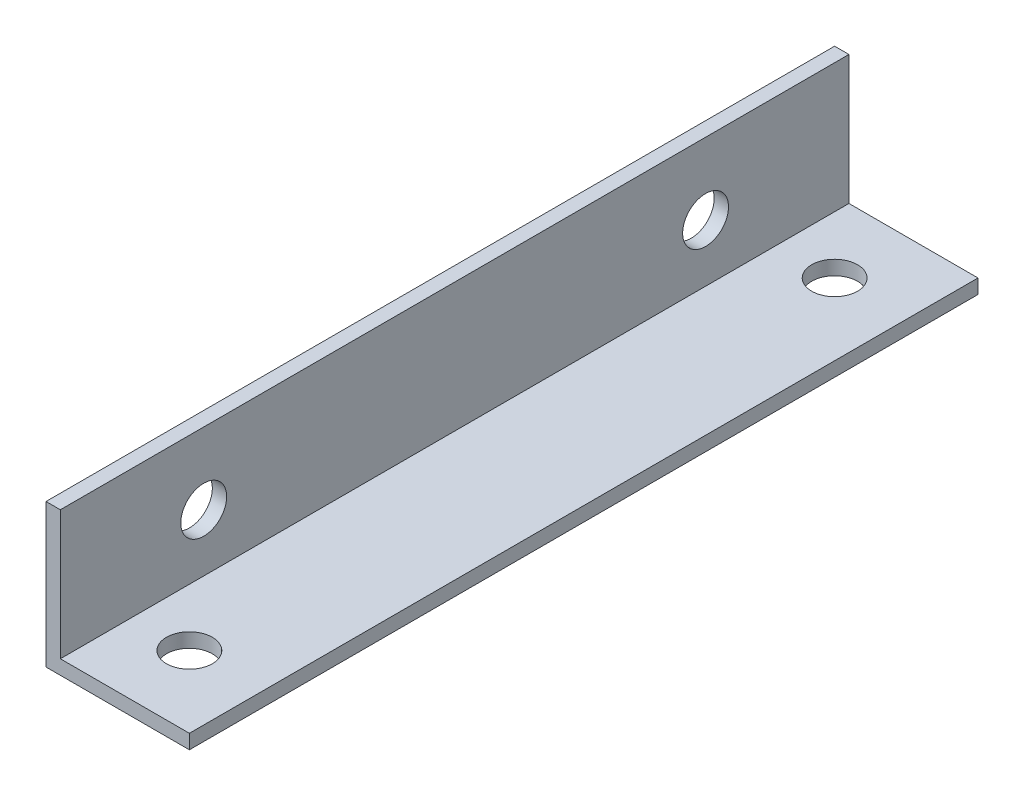
ISO-10303-21;
HEADER;
FILE_DESCRIPTION(('STEP AP214'),'2;1');
FILE_NAME('part.step','',(''),(''),'','','');
FILE_SCHEMA(('AUTOMOTIVE_DESIGN { 1 0 10303 214 1 1 1 1 }'));
ENDSEC;
DATA;
#1=APPLICATION_CONTEXT('core data for automotive mechanical design processes');
#2=APPLICATION_PROTOCOL_DEFINITION('international standard','automotive_design',2000,#1);
#3=PRODUCT_CONTEXT('',#1,'mechanical');
#4=PRODUCT('Part','Part','',(#3));
#5=PRODUCT_RELATED_PRODUCT_CATEGORY('part','',(#4));
#6=PRODUCT_DEFINITION_FORMATION('','',#4);
#7=PRODUCT_DEFINITION_CONTEXT('part definition',#1,'design');
#8=PRODUCT_DEFINITION('design','',#6,#7);
#9=PRODUCT_DEFINITION_SHAPE('','',#8);
#10=(LENGTH_UNIT() NAMED_UNIT(*) SI_UNIT(.MILLI.,.METRE.));
#11=(NAMED_UNIT(*) PLANE_ANGLE_UNIT() SI_UNIT($,.RADIAN.));
#12=(NAMED_UNIT(*) SI_UNIT($,.STERADIAN.) SOLID_ANGLE_UNIT());
#13=UNCERTAINTY_MEASURE_WITH_UNIT(LENGTH_MEASURE(1.E-05),#10,'distance_accuracy_value','');
#14=(GEOMETRIC_REPRESENTATION_CONTEXT(3) GLOBAL_UNCERTAINTY_ASSIGNED_CONTEXT((#13)) GLOBAL_UNIT_ASSIGNED_CONTEXT((#10,
#11,#12)) REPRESENTATION_CONTEXT('',''));
#15=CARTESIAN_POINT('',(0.,0.,0.));
#16=DIRECTION('',(0.,0.,1.));
#17=DIRECTION('',(1.,0.,0.));
#18=AXIS2_PLACEMENT_3D('',#15,#16,#17);
#19=CARTESIAN_POINT('',(-5.,-5.,55.));
#20=DIRECTION('',(1.,0.,0.));
#21=DIRECTION('',(0.,0.,-1.));
#22=AXIS2_PLACEMENT_3D('',#19,#20,#21);
#23=PLANE('',#22);
#24=CARTESIAN_POINT('',(-5.,0.,10.));
#25=DIRECTION('',(-1.,0.,0.));
#26=DIRECTION('',(0.,0.,1.));
#27=AXIS2_PLACEMENT_3D('',#24,#25,#26);
#28=CIRCLE('',#27,1.6);
#29=CARTESIAN_POINT('',(-5.,0.,11.6));
#30=VERTEX_POINT('',#29);
#31=EDGE_CURVE('E143',#30,#30,#28,.T.);
#32=ORIENTED_EDGE('',*,*,#31,.F.);
#33=EDGE_LOOP('',(#32));
#34=FACE_BOUND('',#33,.T.);
#35=CARTESIAN_POINT('',(-5.,0.,45.));
#36=DIRECTION('',(-1.,0.,0.));
#37=DIRECTION('',(0.,0.,1.));
#38=AXIS2_PLACEMENT_3D('',#35,#36,#37);
#39=CIRCLE('',#38,1.6);
#40=CARTESIAN_POINT('',(-5.,0.,46.6));
#41=VERTEX_POINT('',#40);
#42=EDGE_CURVE('E149',#41,#41,#39,.T.);
#43=ORIENTED_EDGE('',*,*,#42,.F.);
#44=EDGE_LOOP('',(#43));
#45=FACE_BOUND('',#44,.T.);
#46=DIRECTION('',(0.,-1.,0.));
#47=VECTOR('',#46,1.);
#48=CARTESIAN_POINT('',(-5.,-5.,0.));
#49=LINE('',#48,#47);
#50=CARTESIAN_POINT('',(-5.,5.,0.));
#51=VERTEX_POINT('',#50);
#52=CARTESIAN_POINT('',(-5.,-5.,0.));
#53=VERTEX_POINT('',#52);
#54=EDGE_CURVE('E119',#51,#53,#49,.T.);
#55=ORIENTED_EDGE('',*,*,#54,.T.);
#56=DIRECTION('',(0.,0.,-1.));
#57=VECTOR('',#56,1.);
#58=CARTESIAN_POINT('',(-5.,-5.,55.));
#59=LINE('',#58,#57);
#60=CARTESIAN_POINT('',(-5.,-5.,55.));
#61=VERTEX_POINT('',#60);
#62=EDGE_CURVE('E11',#61,#53,#59,.T.);
#63=ORIENTED_EDGE('',*,*,#62,.F.);
#64=DIRECTION('',(0.,-1.,0.));
#65=VECTOR('',#64,1.);
#66=CARTESIAN_POINT('',(-5.,-5.,55.));
#67=LINE('',#66,#65);
#68=CARTESIAN_POINT('',(-5.,5.,55.));
#69=VERTEX_POINT('',#68);
#70=EDGE_CURVE('E130',#69,#61,#67,.T.);
#71=ORIENTED_EDGE('',*,*,#70,.F.);
#72=DIRECTION('',(0.,0.,-1.));
#73=VECTOR('',#72,1.);
#74=CARTESIAN_POINT('',(-5.,5.,55.));
#75=LINE('',#74,#73);
#76=EDGE_CURVE('E115',#69,#51,#75,.T.);
#77=ORIENTED_EDGE('',*,*,#76,.T.);
#78=EDGE_LOOP('',(#55,#63,#71,#77));
#79=FACE_BOUND('',#78,.T.);
#80=ADVANCED_FACE('F33',(#34,#45,#79),#23,.F.);
#81=CARTESIAN_POINT('',(5.,-5.,55.));
#82=DIRECTION('',(0.,1.,0.));
#83=DIRECTION('',(-1.,0.,0.));
#84=AXIS2_PLACEMENT_3D('',#81,#82,#83);
#85=PLANE('',#84);
#86=CARTESIAN_POINT('',(0.,-5.,5.));
#87=DIRECTION('',(0.,-1.,0.));
#88=DIRECTION('',(1.,0.,0.));
#89=AXIS2_PLACEMENT_3D('',#86,#87,#88);
#90=CIRCLE('',#89,1.6);
#91=CARTESIAN_POINT('',(1.6,-5.,5.));
#92=VERTEX_POINT('',#91);
#93=EDGE_CURVE('E139',#92,#92,#90,.T.);
#94=ORIENTED_EDGE('',*,*,#93,.F.);
#95=EDGE_LOOP('',(#94));
#96=FACE_BOUND('',#95,.T.);
#97=CARTESIAN_POINT('',(0.,-5.,50.));
#98=DIRECTION('',(0.,-1.,0.));
#99=DIRECTION('',(1.,0.,0.));
#100=AXIS2_PLACEMENT_3D('',#97,#98,#99);
#101=CIRCLE('',#100,1.6);
#102=CARTESIAN_POINT('',(1.6,-5.,50.));
#103=VERTEX_POINT('',#102);
#104=EDGE_CURVE('E147',#103,#103,#101,.T.);
#105=ORIENTED_EDGE('',*,*,#104,.F.);
#106=EDGE_LOOP('',(#105));
#107=FACE_BOUND('',#106,.T.);
#108=DIRECTION('',(1.,0.,0.));
#109=VECTOR('',#108,1.);
#110=CARTESIAN_POINT('',(5.,-5.,0.));
#111=LINE('',#110,#109);
#112=CARTESIAN_POINT('',(5.,-5.,0.));
#113=VERTEX_POINT('',#112);
#114=EDGE_CURVE('E122',#53,#113,#111,.T.);
#115=ORIENTED_EDGE('',*,*,#114,.T.);
#116=DIRECTION('',(0.,0.,-1.));
#117=VECTOR('',#116,1.);
#118=CARTESIAN_POINT('',(5.,-5.,55.));
#119=LINE('',#118,#117);
#120=CARTESIAN_POINT('',(5.,-5.,55.));
#121=VERTEX_POINT('',#120);
#122=EDGE_CURVE('E42',#121,#113,#119,.T.);
#123=ORIENTED_EDGE('',*,*,#122,.F.);
#124=DIRECTION('',(1.,0.,0.));
#125=VECTOR('',#124,1.);
#126=CARTESIAN_POINT('',(5.,-5.,55.));
#127=LINE('',#126,#125);
#128=EDGE_CURVE('E88',#61,#121,#127,.T.);
#129=ORIENTED_EDGE('',*,*,#128,.F.);
#130=ORIENTED_EDGE('',*,*,#62,.T.);
#131=EDGE_LOOP('',(#115,#123,#129,#130));
#132=FACE_BOUND('',#131,.T.);
#133=ADVANCED_FACE('F163',(#96,#107,#132),#85,.F.);
#134=CARTESIAN_POINT('',(5.,-5.,55.));
#135=DIRECTION('',(-1.,0.,0.));
#136=DIRECTION('',(0.,-1.,0.));
#137=AXIS2_PLACEMENT_3D('',#134,#135,#136);
#138=PLANE('',#137);
#139=DIRECTION('',(0.,1.,0.));
#140=VECTOR('',#139,1.);
#141=CARTESIAN_POINT('',(5.,-5.,0.));
#142=LINE('',#141,#140);
#143=CARTESIAN_POINT('',(5.,-4.,0.));
#144=VERTEX_POINT('',#143);
#145=EDGE_CURVE('E125',#113,#144,#142,.T.);
#146=ORIENTED_EDGE('',*,*,#145,.T.);
#147=DIRECTION('',(0.,0.,-1.));
#148=VECTOR('',#147,1.);
#149=CARTESIAN_POINT('',(5.,-4.,55.));
#150=LINE('',#149,#148);
#151=CARTESIAN_POINT('',(5.,-4.,55.));
#152=VERTEX_POINT('',#151);
#153=EDGE_CURVE('E110',#152,#144,#150,.T.);
#154=ORIENTED_EDGE('',*,*,#153,.F.);
#155=DIRECTION('',(0.,1.,0.));
#156=VECTOR('',#155,1.);
#157=CARTESIAN_POINT('',(5.,-5.,55.));
#158=LINE('',#157,#156);
#159=EDGE_CURVE('E101',#121,#152,#158,.T.);
#160=ORIENTED_EDGE('',*,*,#159,.F.);
#161=ORIENTED_EDGE('',*,*,#122,.T.);
#162=EDGE_LOOP('',(#146,#154,#160,#161));
#163=FACE_BOUND('',#162,.T.);
#164=ADVANCED_FACE('F166',(#163),#138,.F.);
#165=CARTESIAN_POINT('',(-4.,-4.,55.));
#166=DIRECTION('',(0.,-1.,0.));
#167=DIRECTION('',(1.,0.,0.));
#168=AXIS2_PLACEMENT_3D('',#165,#166,#167);
#169=PLANE('',#168);
#170=CARTESIAN_POINT('',(0.,-4.,5.));
#171=DIRECTION('',(0.,-1.,0.));
#172=DIRECTION('',(1.,0.,0.));
#173=AXIS2_PLACEMENT_3D('',#170,#171,#172);
#174=CIRCLE('',#173,1.6);
#175=CARTESIAN_POINT('',(1.6,-4.,5.));
#176=VERTEX_POINT('',#175);
#177=EDGE_CURVE('E123',#176,#176,#174,.T.);
#178=ORIENTED_EDGE('',*,*,#177,.T.);
#179=EDGE_LOOP('',(#178));
#180=FACE_BOUND('',#179,.T.);
#181=CARTESIAN_POINT('',(0.,-4.,50.));
#182=DIRECTION('',(0.,-1.,0.));
#183=DIRECTION('',(1.,0.,0.));
#184=AXIS2_PLACEMENT_3D('',#181,#182,#183);
#185=CIRCLE('',#184,1.6);
#186=CARTESIAN_POINT('',(1.6,-4.,50.));
#187=VERTEX_POINT('',#186);
#188=EDGE_CURVE('E136',#187,#187,#185,.T.);
#189=ORIENTED_EDGE('',*,*,#188,.T.);
#190=EDGE_LOOP('',(#189));
#191=FACE_BOUND('',#190,.T.);
#192=DIRECTION('',(-1.,0.,0.));
#193=VECTOR('',#192,1.);
#194=CARTESIAN_POINT('',(-4.,-4.,0.));
#195=LINE('',#194,#193);
#196=CARTESIAN_POINT('',(-4.,-4.,0.));
#197=VERTEX_POINT('',#196);
#198=EDGE_CURVE('E109',#144,#197,#195,.T.);
#199=ORIENTED_EDGE('',*,*,#198,.T.);
#200=DIRECTION('',(0.,0.,-1.));
#201=VECTOR('',#200,1.);
#202=CARTESIAN_POINT('',(-4.,-4.,55.));
#203=LINE('',#202,#201);
#204=CARTESIAN_POINT('',(-4.,-4.,55.));
#205=VERTEX_POINT('',#204);
#206=EDGE_CURVE('E106',#205,#197,#203,.T.);
#207=ORIENTED_EDGE('',*,*,#206,.F.);
#208=DIRECTION('',(-1.,0.,0.));
#209=VECTOR('',#208,1.);
#210=CARTESIAN_POINT('',(-4.,-4.,55.));
#211=LINE('',#210,#209);
#212=EDGE_CURVE('E95',#152,#205,#211,.T.);
#213=ORIENTED_EDGE('',*,*,#212,.F.);
#214=ORIENTED_EDGE('',*,*,#153,.T.);
#215=EDGE_LOOP('',(#199,#207,#213,#214));
#216=FACE_BOUND('',#215,.T.);
#217=ADVANCED_FACE('F107',(#180,#191,#216),#169,.F.);
#218=CARTESIAN_POINT('',(-4.,5.,55.));
#219=DIRECTION('',(-1.,0.,0.));
#220=DIRECTION('',(0.,0.,1.));
#221=AXIS2_PLACEMENT_3D('',#218,#219,#220);
#222=PLANE('',#221);
#223=CARTESIAN_POINT('',(-4.,0.,10.));
#224=DIRECTION('',(-1.,0.,0.));
#225=DIRECTION('',(0.,0.,1.));
#226=AXIS2_PLACEMENT_3D('',#223,#224,#225);
#227=CIRCLE('',#226,1.6);
#228=CARTESIAN_POINT('',(-4.,0.,11.6));
#229=VERTEX_POINT('',#228);
#230=EDGE_CURVE('E36',#229,#229,#227,.T.);
#231=ORIENTED_EDGE('',*,*,#230,.T.);
#232=EDGE_LOOP('',(#231));
#233=FACE_BOUND('',#232,.T.);
#234=CARTESIAN_POINT('',(-4.,0.,45.));
#235=DIRECTION('',(-1.,0.,0.));
#236=DIRECTION('',(0.,0.,1.));
#237=AXIS2_PLACEMENT_3D('',#234,#235,#236);
#238=CIRCLE('',#237,1.6);
#239=CARTESIAN_POINT('',(-4.,0.,46.6));
#240=VERTEX_POINT('',#239);
#241=EDGE_CURVE('E141',#240,#240,#238,.T.);
#242=ORIENTED_EDGE('',*,*,#241,.T.);
#243=EDGE_LOOP('',(#242));
#244=FACE_BOUND('',#243,.T.);
#245=DIRECTION('',(0.,1.,0.));
#246=VECTOR('',#245,1.);
#247=CARTESIAN_POINT('',(-4.,5.,0.));
#248=LINE('',#247,#246);
#249=CARTESIAN_POINT('',(-4.,5.,0.));
#250=VERTEX_POINT('',#249);
#251=EDGE_CURVE('E74',#197,#250,#248,.T.);
#252=ORIENTED_EDGE('',*,*,#251,.T.);
#253=DIRECTION('',(0.,0.,-1.));
#254=VECTOR('',#253,1.);
#255=CARTESIAN_POINT('',(-4.,5.,55.));
#256=LINE('',#255,#254);
#257=CARTESIAN_POINT('',(-4.,5.,55.));
#258=VERTEX_POINT('',#257);
#259=EDGE_CURVE('E111',#258,#250,#256,.T.);
#260=ORIENTED_EDGE('',*,*,#259,.F.);
#261=DIRECTION('',(0.,1.,0.));
#262=VECTOR('',#261,1.);
#263=CARTESIAN_POINT('',(-4.,5.,55.));
#264=LINE('',#263,#262);
#265=EDGE_CURVE('E99',#205,#258,#264,.T.);
#266=ORIENTED_EDGE('',*,*,#265,.F.);
#267=ORIENTED_EDGE('',*,*,#206,.T.);
#268=EDGE_LOOP('',(#252,#260,#266,#267));
#269=FACE_BOUND('',#268,.T.);
#270=ADVANCED_FACE('F113',(#233,#244,#269),#222,.F.);
#271=CARTESIAN_POINT('',(-4.,5.,55.));
#272=DIRECTION('',(0.,-1.,0.));
#273=DIRECTION('',(1.,0.,0.));
#274=AXIS2_PLACEMENT_3D('',#271,#272,#273);
#275=PLANE('',#274);
#276=DIRECTION('',(-1.,0.,0.));
#277=VECTOR('',#276,1.);
#278=CARTESIAN_POINT('',(-4.,5.,0.));
#279=LINE('',#278,#277);
#280=EDGE_CURVE('E80',#250,#51,#279,.T.);
#281=ORIENTED_EDGE('',*,*,#280,.T.);
#282=ORIENTED_EDGE('',*,*,#76,.F.);
#283=DIRECTION('',(-1.,0.,0.));
#284=VECTOR('',#283,1.);
#285=CARTESIAN_POINT('',(-4.,5.,55.));
#286=LINE('',#285,#284);
#287=EDGE_CURVE('E51',#258,#69,#286,.T.);
#288=ORIENTED_EDGE('',*,*,#287,.F.);
#289=ORIENTED_EDGE('',*,*,#259,.T.);
#290=EDGE_LOOP('',(#281,#282,#288,#289));
#291=FACE_BOUND('',#290,.T.);
#292=ADVANCED_FACE('F171',(#291),#275,.F.);
#293=CARTESIAN_POINT('',(0.,0.,55.));
#294=DIRECTION('',(0.,0.,1.));
#295=DIRECTION('',(1.,0.,0.));
#296=AXIS2_PLACEMENT_3D('',#293,#294,#295);
#297=PLANE('',#296);
#298=ORIENTED_EDGE('',*,*,#70,.T.);
#299=ORIENTED_EDGE('',*,*,#128,.T.);
#300=ORIENTED_EDGE('',*,*,#159,.T.);
#301=ORIENTED_EDGE('',*,*,#212,.T.);
#302=ORIENTED_EDGE('',*,*,#265,.T.);
#303=ORIENTED_EDGE('',*,*,#287,.T.);
#304=EDGE_LOOP('',(#298,#299,#300,#301,#302,#303));
#305=FACE_BOUND('',#304,.T.);
#306=ADVANCED_FACE('F97',(#305),#297,.T.);
#307=CARTESIAN_POINT('',(0.,0.,0.));
#308=DIRECTION('',(0.,0.,1.));
#309=DIRECTION('',(1.,0.,0.));
#310=AXIS2_PLACEMENT_3D('',#307,#308,#309);
#311=PLANE('',#310);
#312=ORIENTED_EDGE('',*,*,#54,.F.);
#313=ORIENTED_EDGE('',*,*,#280,.F.);
#314=ORIENTED_EDGE('',*,*,#251,.F.);
#315=ORIENTED_EDGE('',*,*,#198,.F.);
#316=ORIENTED_EDGE('',*,*,#145,.F.);
#317=ORIENTED_EDGE('',*,*,#114,.F.);
#318=EDGE_LOOP('',(#312,#313,#314,#315,#316,#317));
#319=FACE_BOUND('',#318,.T.);
#320=ADVANCED_FACE('F169',(#319),#311,.F.);
#321=CARTESIAN_POINT('',(0.,5.,50.));
#322=DIRECTION('',(0.,-1.,0.));
#323=DIRECTION('',(1.,0.,0.));
#324=AXIS2_PLACEMENT_3D('',#321,#322,#323);
#325=CYLINDRICAL_SURFACE('',#324,1.6);
#326=ORIENTED_EDGE('',*,*,#104,.T.);
#327=EDGE_LOOP('',(#326));
#328=FACE_BOUND('',#327,.T.);
#329=ORIENTED_EDGE('',*,*,#188,.F.);
#330=EDGE_LOOP('',(#329));
#331=FACE_BOUND('',#330,.T.);
#332=ADVANCED_FACE('F202',(#328,#331),#325,.F.);
#333=CARTESIAN_POINT('',(0.,5.,5.));
#334=DIRECTION('',(0.,-1.,0.));
#335=DIRECTION('',(1.,0.,0.));
#336=AXIS2_PLACEMENT_3D('',#333,#334,#335);
#337=CYLINDRICAL_SURFACE('',#336,1.6);
#338=ORIENTED_EDGE('',*,*,#93,.T.);
#339=EDGE_LOOP('',(#338));
#340=FACE_BOUND('',#339,.T.);
#341=ORIENTED_EDGE('',*,*,#177,.F.);
#342=EDGE_LOOP('',(#341));
#343=FACE_BOUND('',#342,.T.);
#344=ADVANCED_FACE('F195',(#340,#343),#337,.F.);
#345=CARTESIAN_POINT('',(5.,0.,45.));
#346=DIRECTION('',(-1.,0.,0.));
#347=DIRECTION('',(0.,0.,1.));
#348=AXIS2_PLACEMENT_3D('',#345,#346,#347);
#349=CYLINDRICAL_SURFACE('',#348,1.6);
#350=ORIENTED_EDGE('',*,*,#42,.T.);
#351=EDGE_LOOP('',(#350));
#352=FACE_BOUND('',#351,.T.);
#353=ORIENTED_EDGE('',*,*,#241,.F.);
#354=EDGE_LOOP('',(#353));
#355=FACE_BOUND('',#354,.T.);
#356=ADVANCED_FACE('F191',(#352,#355),#349,.F.);
#357=CARTESIAN_POINT('',(5.,0.,10.));
#358=DIRECTION('',(-1.,0.,0.));
#359=DIRECTION('',(0.,0.,1.));
#360=AXIS2_PLACEMENT_3D('',#357,#358,#359);
#361=CYLINDRICAL_SURFACE('',#360,1.6);
#362=ORIENTED_EDGE('',*,*,#31,.T.);
#363=EDGE_LOOP('',(#362));
#364=FACE_BOUND('',#363,.T.);
#365=ORIENTED_EDGE('',*,*,#230,.F.);
#366=EDGE_LOOP('',(#365));
#367=FACE_BOUND('',#366,.T.);
#368=ADVANCED_FACE('F194',(#364,#367),#361,.F.);
#369=CLOSED_SHELL('',(#80,#133,#164,#217,#270,#292,#306,#320,#332,#344,#356,#368));
#370=MANIFOLD_SOLID_BREP('B2',#369);
#371=ADVANCED_BREP_SHAPE_REPRESENTATION('',(#18,#370),#14);
#372=SHAPE_DEFINITION_REPRESENTATION(#9,#371);
ENDSEC;
END-ISO-10303-21;
